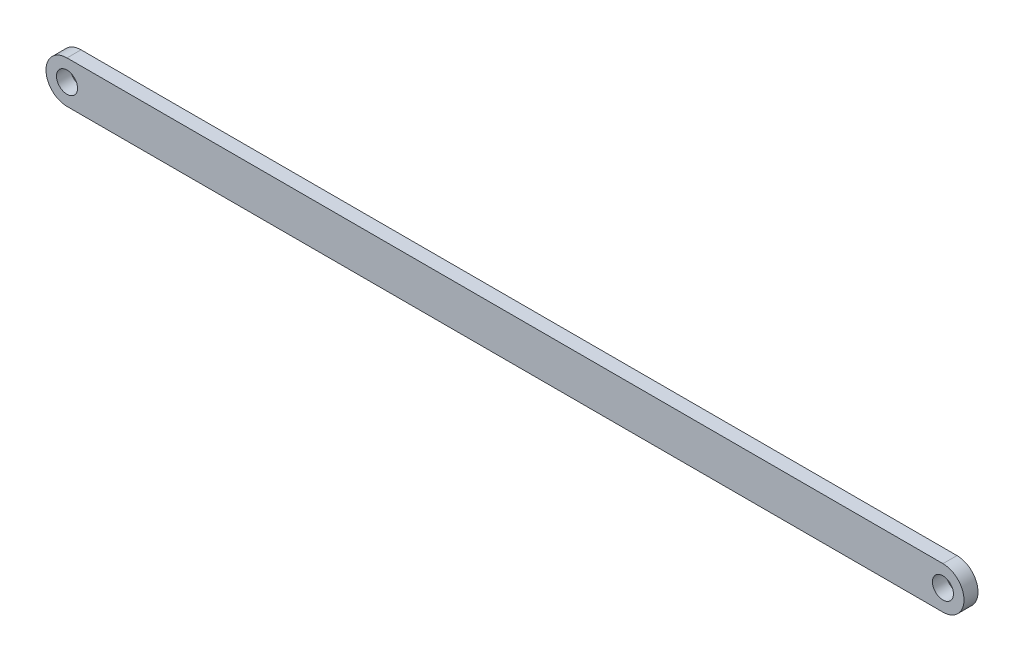
ISO-10303-21;
HEADER;
FILE_DESCRIPTION(('STEP AP214'),'2;1');
FILE_NAME('part.step','',(''),(''),'','','');
FILE_SCHEMA(('AUTOMOTIVE_DESIGN { 1 0 10303 214 1 1 1 1 }'));
ENDSEC;
DATA;
#1=APPLICATION_CONTEXT('core data for automotive mechanical design processes');
#2=APPLICATION_PROTOCOL_DEFINITION('international standard','automotive_design',2000,#1);
#3=PRODUCT_CONTEXT('',#1,'mechanical');
#4=PRODUCT('Part','Part','',(#3));
#5=PRODUCT_RELATED_PRODUCT_CATEGORY('part','',(#4));
#6=PRODUCT_DEFINITION_FORMATION('','',#4);
#7=PRODUCT_DEFINITION_CONTEXT('part definition',#1,'design');
#8=PRODUCT_DEFINITION('design','',#6,#7);
#9=PRODUCT_DEFINITION_SHAPE('','',#8);
#10=(LENGTH_UNIT() NAMED_UNIT(*) SI_UNIT(.MILLI.,.METRE.));
#11=(NAMED_UNIT(*) PLANE_ANGLE_UNIT() SI_UNIT($,.RADIAN.));
#12=(NAMED_UNIT(*) SI_UNIT($,.STERADIAN.) SOLID_ANGLE_UNIT());
#13=UNCERTAINTY_MEASURE_WITH_UNIT(LENGTH_MEASURE(1.E-05),#10,'distance_accuracy_value','');
#14=(GEOMETRIC_REPRESENTATION_CONTEXT(3) GLOBAL_UNCERTAINTY_ASSIGNED_CONTEXT((#13)) GLOBAL_UNIT_ASSIGNED_CONTEXT((#10,
#11,#12)) REPRESENTATION_CONTEXT('',''));
#15=CARTESIAN_POINT('',(0.,0.,0.));
#16=DIRECTION('',(0.,0.,1.));
#17=DIRECTION('',(1.,0.,0.));
#18=AXIS2_PLACEMENT_3D('',#15,#16,#17);
#19=CARTESIAN_POINT('',(0.,0.,4.));
#20=DIRECTION('',(0.,0.,1.));
#21=DIRECTION('',(1.,0.,0.));
#22=AXIS2_PLACEMENT_3D('',#19,#20,#21);
#23=PLANE('',#22);
#24=CARTESIAN_POINT('',(0.,0.,4.));
#25=DIRECTION('',(0.,0.,1.));
#26=DIRECTION('',(1.,0.,0.));
#27=AXIS2_PLACEMENT_3D('',#24,#25,#26);
#28=CIRCLE('',#27,3.);
#29=CARTESIAN_POINT('',(3.,0.,4.));
#30=VERTEX_POINT('',#29);
#31=EDGE_CURVE('E102',#30,#30,#28,.T.);
#32=ORIENTED_EDGE('',*,*,#31,.F.);
#33=EDGE_LOOP('',(#32));
#34=FACE_BOUND('',#33,.T.);
#35=CARTESIAN_POINT('',(0.,0.,4.));
#36=DIRECTION('',(0.,0.,1.));
#37=DIRECTION('',(1.,0.,0.));
#38=AXIS2_PLACEMENT_3D('',#35,#36,#37);
#39=CIRCLE('',#38,6.);
#40=CARTESIAN_POINT('',(0.,6.,4.));
#41=VERTEX_POINT('',#40);
#42=CARTESIAN_POINT('',(0.,-6.,4.));
#43=VERTEX_POINT('',#42);
#44=EDGE_CURVE('E87',#41,#43,#39,.T.);
#45=ORIENTED_EDGE('',*,*,#44,.T.);
#46=DIRECTION('',(1.,0.,0.));
#47=VECTOR('',#46,1.);
#48=CARTESIAN_POINT('',(0.,-6.,4.));
#49=LINE('',#48,#47);
#50=CARTESIAN_POINT('',(250.,-6.,4.));
#51=VERTEX_POINT('',#50);
#52=EDGE_CURVE('E82',#43,#51,#49,.T.);
#53=ORIENTED_EDGE('',*,*,#52,.T.);
#54=CARTESIAN_POINT('',(250.,0.,4.));
#55=DIRECTION('',(0.,0.,1.));
#56=DIRECTION('',(1.,0.,0.));
#57=AXIS2_PLACEMENT_3D('',#54,#55,#56);
#58=CIRCLE('',#57,6.);
#59=CARTESIAN_POINT('',(250.,6.,4.));
#60=VERTEX_POINT('',#59);
#61=EDGE_CURVE('E85',#51,#60,#58,.T.);
#62=ORIENTED_EDGE('',*,*,#61,.T.);
#63=DIRECTION('',(-1.,0.,0.));
#64=VECTOR('',#63,1.);
#65=CARTESIAN_POINT('',(0.,6.,4.));
#66=LINE('',#65,#64);
#67=EDGE_CURVE('E52',#60,#41,#66,.T.);
#68=ORIENTED_EDGE('',*,*,#67,.T.);
#69=EDGE_LOOP('',(#45,#53,#62,#68));
#70=FACE_BOUND('',#69,.T.);
#71=CARTESIAN_POINT('',(250.,0.,4.));
#72=DIRECTION('',(0.,0.,1.));
#73=DIRECTION('',(1.,0.,0.));
#74=AXIS2_PLACEMENT_3D('',#71,#72,#73);
#75=CIRCLE('',#74,2.99999999999999);
#76=CARTESIAN_POINT('',(253.,0.,4.));
#77=VERTEX_POINT('',#76);
#78=EDGE_CURVE('E117',#77,#77,#75,.T.);
#79=ORIENTED_EDGE('',*,*,#78,.F.);
#80=EDGE_LOOP('',(#79));
#81=FACE_BOUND('',#80,.T.);
#82=ADVANCED_FACE('F35',(#34,#70,#81),#23,.T.);
#83=CARTESIAN_POINT('',(0.,0.,0.));
#84=DIRECTION('',(0.,0.,1.));
#85=DIRECTION('',(1.,0.,0.));
#86=AXIS2_PLACEMENT_3D('',#83,#84,#85);
#87=PLANE('',#86);
#88=CARTESIAN_POINT('',(0.,0.,0.));
#89=DIRECTION('',(0.,0.,1.));
#90=DIRECTION('',(1.,0.,0.));
#91=AXIS2_PLACEMENT_3D('',#88,#89,#90);
#92=CIRCLE('',#91,6.);
#93=CARTESIAN_POINT('',(0.,6.,0.));
#94=VERTEX_POINT('',#93);
#95=CARTESIAN_POINT('',(0.,-6.,0.));
#96=VERTEX_POINT('',#95);
#97=EDGE_CURVE('E99',#94,#96,#92,.T.);
#98=ORIENTED_EDGE('',*,*,#97,.F.);
#99=DIRECTION('',(-1.,0.,0.));
#100=VECTOR('',#99,1.);
#101=CARTESIAN_POINT('',(0.,6.,0.));
#102=LINE('',#101,#100);
#103=CARTESIAN_POINT('',(250.,6.,0.));
#104=VERTEX_POINT('',#103);
#105=EDGE_CURVE('E75',#104,#94,#102,.T.);
#106=ORIENTED_EDGE('',*,*,#105,.F.);
#107=CARTESIAN_POINT('',(250.,0.,0.));
#108=DIRECTION('',(0.,0.,1.));
#109=DIRECTION('',(1.,0.,0.));
#110=AXIS2_PLACEMENT_3D('',#107,#108,#109);
#111=CIRCLE('',#110,6.);
#112=CARTESIAN_POINT('',(250.,-6.,0.));
#113=VERTEX_POINT('',#112);
#114=EDGE_CURVE('E69',#113,#104,#111,.T.);
#115=ORIENTED_EDGE('',*,*,#114,.F.);
#116=DIRECTION('',(1.,0.,0.));
#117=VECTOR('',#116,1.);
#118=CARTESIAN_POINT('',(0.,-6.,0.));
#119=LINE('',#118,#117);
#120=EDGE_CURVE('E91',#96,#113,#119,.T.);
#121=ORIENTED_EDGE('',*,*,#120,.F.);
#122=EDGE_LOOP('',(#98,#106,#115,#121));
#123=FACE_BOUND('',#122,.T.);
#124=CARTESIAN_POINT('',(0.,0.,0.));
#125=DIRECTION('',(0.,0.,1.));
#126=DIRECTION('',(1.,0.,0.));
#127=AXIS2_PLACEMENT_3D('',#124,#125,#126);
#128=CIRCLE('',#127,3.);
#129=CARTESIAN_POINT('',(3.,0.,0.));
#130=VERTEX_POINT('',#129);
#131=EDGE_CURVE('E114',#130,#130,#128,.T.);
#132=ORIENTED_EDGE('',*,*,#131,.T.);
#133=EDGE_LOOP('',(#132));
#134=FACE_BOUND('',#133,.T.);
#135=CARTESIAN_POINT('',(250.,0.,0.));
#136=DIRECTION('',(0.,0.,1.));
#137=DIRECTION('',(1.,0.,0.));
#138=AXIS2_PLACEMENT_3D('',#135,#136,#137);
#139=CIRCLE('',#138,2.99999999999999);
#140=CARTESIAN_POINT('',(253.,0.,0.));
#141=VERTEX_POINT('',#140);
#142=EDGE_CURVE('E120',#141,#141,#139,.T.);
#143=ORIENTED_EDGE('',*,*,#142,.T.);
#144=EDGE_LOOP('',(#143));
#145=FACE_BOUND('',#144,.T.);
#146=ADVANCED_FACE('F110',(#123,#134,#145),#87,.F.);
#147=CARTESIAN_POINT('',(0.,0.,4.));
#148=DIRECTION('',(0.,0.,-1.));
#149=DIRECTION('',(-1.,0.,0.));
#150=AXIS2_PLACEMENT_3D('',#147,#148,#149);
#151=CYLINDRICAL_SURFACE('',#150,6.);
#152=ORIENTED_EDGE('',*,*,#97,.T.);
#153=DIRECTION('',(0.,0.,-1.));
#154=VECTOR('',#153,1.);
#155=CARTESIAN_POINT('',(0.,-6.,4.));
#156=LINE('',#155,#154);
#157=EDGE_CURVE('E11',#43,#96,#156,.T.);
#158=ORIENTED_EDGE('',*,*,#157,.F.);
#159=ORIENTED_EDGE('',*,*,#44,.F.);
#160=DIRECTION('',(0.,0.,-1.));
#161=VECTOR('',#160,1.);
#162=CARTESIAN_POINT('',(0.,6.,4.));
#163=LINE('',#162,#161);
#164=EDGE_CURVE('E95',#41,#94,#163,.T.);
#165=ORIENTED_EDGE('',*,*,#164,.T.);
#166=EDGE_LOOP('',(#152,#158,#159,#165));
#167=FACE_BOUND('',#166,.T.);
#168=ADVANCED_FACE('F37',(#167),#151,.T.);
#169=CARTESIAN_POINT('',(0.,-6.,4.));
#170=DIRECTION('',(0.,1.,0.));
#171=DIRECTION('',(0.,0.,1.));
#172=AXIS2_PLACEMENT_3D('',#169,#170,#171);
#173=PLANE('',#172);
#174=ORIENTED_EDGE('',*,*,#120,.T.);
#175=DIRECTION('',(0.,0.,-1.));
#176=VECTOR('',#175,1.);
#177=CARTESIAN_POINT('',(250.,-6.,4.));
#178=LINE('',#177,#176);
#179=EDGE_CURVE('E44',#51,#113,#178,.T.);
#180=ORIENTED_EDGE('',*,*,#179,.F.);
#181=ORIENTED_EDGE('',*,*,#52,.F.);
#182=ORIENTED_EDGE('',*,*,#157,.T.);
#183=EDGE_LOOP('',(#174,#180,#181,#182));
#184=FACE_BOUND('',#183,.T.);
#185=ADVANCED_FACE('F90',(#184),#173,.F.);
#186=CARTESIAN_POINT('',(250.,0.,4.));
#187=DIRECTION('',(0.,0.,-1.));
#188=DIRECTION('',(-1.,0.,0.));
#189=AXIS2_PLACEMENT_3D('',#186,#187,#188);
#190=CYLINDRICAL_SURFACE('',#189,6.);
#191=ORIENTED_EDGE('',*,*,#114,.T.);
#192=DIRECTION('',(0.,0.,-1.));
#193=VECTOR('',#192,1.);
#194=CARTESIAN_POINT('',(250.,6.,4.));
#195=LINE('',#194,#193);
#196=EDGE_CURVE('E92',#60,#104,#195,.T.);
#197=ORIENTED_EDGE('',*,*,#196,.F.);
#198=ORIENTED_EDGE('',*,*,#61,.F.);
#199=ORIENTED_EDGE('',*,*,#179,.T.);
#200=EDGE_LOOP('',(#191,#197,#198,#199));
#201=FACE_BOUND('',#200,.T.);
#202=ADVANCED_FACE('F93',(#201),#190,.T.);
#203=CARTESIAN_POINT('',(0.,6.,4.));
#204=DIRECTION('',(0.,-1.,0.));
#205=DIRECTION('',(0.,0.,-1.));
#206=AXIS2_PLACEMENT_3D('',#203,#204,#205);
#207=PLANE('',#206);
#208=ORIENTED_EDGE('',*,*,#105,.T.);
#209=ORIENTED_EDGE('',*,*,#164,.F.);
#210=ORIENTED_EDGE('',*,*,#67,.F.);
#211=ORIENTED_EDGE('',*,*,#196,.T.);
#212=EDGE_LOOP('',(#208,#209,#210,#211));
#213=FACE_BOUND('',#212,.T.);
#214=ADVANCED_FACE('F107',(#213),#207,.F.);
#215=CARTESIAN_POINT('',(0.,0.,4.));
#216=DIRECTION('',(0.,0.,-1.));
#217=DIRECTION('',(-1.,0.,0.));
#218=AXIS2_PLACEMENT_3D('',#215,#216,#217);
#219=CYLINDRICAL_SURFACE('',#218,3.);
#220=ORIENTED_EDGE('',*,*,#31,.T.);
#221=EDGE_LOOP('',(#220));
#222=FACE_BOUND('',#221,.T.);
#223=ORIENTED_EDGE('',*,*,#131,.F.);
#224=EDGE_LOOP('',(#223));
#225=FACE_BOUND('',#224,.T.);
#226=ADVANCED_FACE('F137',(#222,#225),#219,.F.);
#227=CARTESIAN_POINT('',(250.,0.,4.));
#228=DIRECTION('',(0.,0.,-1.));
#229=DIRECTION('',(-1.,0.,0.));
#230=AXIS2_PLACEMENT_3D('',#227,#228,#229);
#231=CYLINDRICAL_SURFACE('',#230,2.99999999999999);
#232=ORIENTED_EDGE('',*,*,#78,.T.);
#233=EDGE_LOOP('',(#232));
#234=FACE_BOUND('',#233,.T.);
#235=ORIENTED_EDGE('',*,*,#142,.F.);
#236=EDGE_LOOP('',(#235));
#237=FACE_BOUND('',#236,.T.);
#238=ADVANCED_FACE('F126',(#234,#237),#231,.F.);
#239=CLOSED_SHELL('',(#82,#146,#168,#185,#202,#214,#226,#238));
#240=MANIFOLD_SOLID_BREP('B2',#239);
#241=ADVANCED_BREP_SHAPE_REPRESENTATION('',(#18,#240),#14);
#242=SHAPE_DEFINITION_REPRESENTATION(#9,#241);
ENDSEC;
END-ISO-10303-21;
